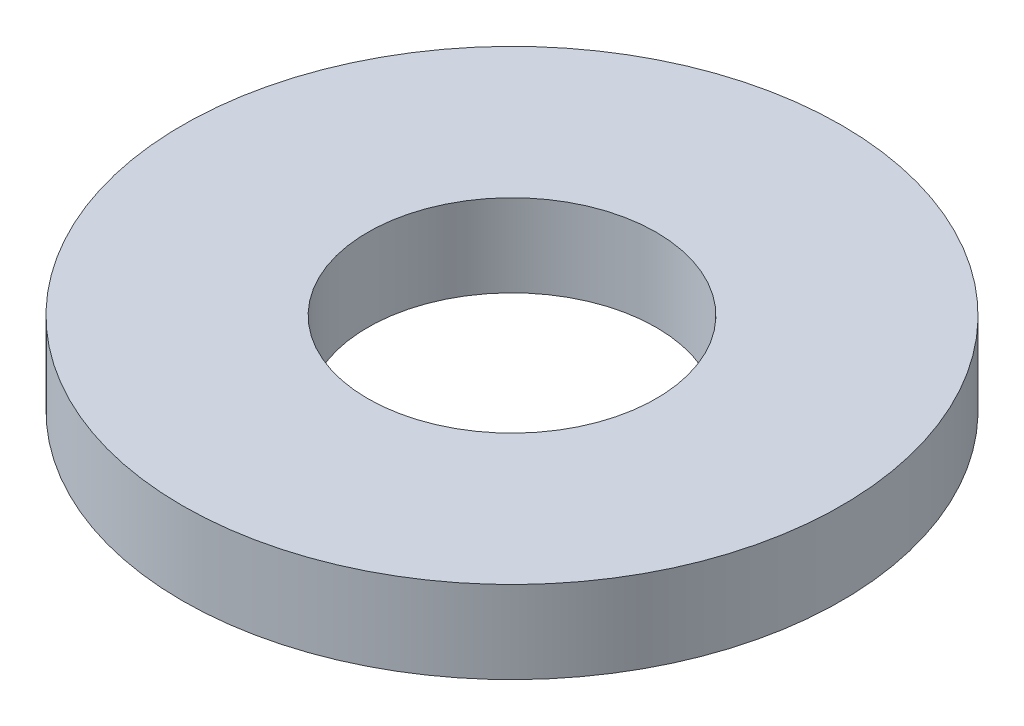
ISO-10303-21;
HEADER;
FILE_DESCRIPTION(('STEP AP214'),'2;1');
FILE_NAME('part.step','',(''),(''),'','','');
FILE_SCHEMA(('AUTOMOTIVE_DESIGN { 1 0 10303 214 1 1 1 1 }'));
ENDSEC;
DATA;
#1=APPLICATION_CONTEXT('core data for automotive mechanical design processes');
#2=APPLICATION_PROTOCOL_DEFINITION('international standard','automotive_design',2000,#1);
#3=PRODUCT_CONTEXT('',#1,'mechanical');
#4=PRODUCT('Part','Part','',(#3));
#5=PRODUCT_RELATED_PRODUCT_CATEGORY('part','',(#4));
#6=PRODUCT_DEFINITION_FORMATION('','',#4);
#7=PRODUCT_DEFINITION_CONTEXT('part definition',#1,'design');
#8=PRODUCT_DEFINITION('design','',#6,#7);
#9=PRODUCT_DEFINITION_SHAPE('','',#8);
#10=(LENGTH_UNIT() NAMED_UNIT(*) SI_UNIT(.MILLI.,.METRE.));
#11=(NAMED_UNIT(*) PLANE_ANGLE_UNIT() SI_UNIT($,.RADIAN.));
#12=(NAMED_UNIT(*) SI_UNIT($,.STERADIAN.) SOLID_ANGLE_UNIT());
#13=UNCERTAINTY_MEASURE_WITH_UNIT(LENGTH_MEASURE(1.E-05),#10,'distance_accuracy_value','');
#14=(GEOMETRIC_REPRESENTATION_CONTEXT(3) GLOBAL_UNCERTAINTY_ASSIGNED_CONTEXT((#13)) GLOBAL_UNIT_ASSIGNED_CONTEXT((#10,
#11,#12)) REPRESENTATION_CONTEXT('',''));
#15=CARTESIAN_POINT('',(0.,0.,0.));
#16=DIRECTION('',(0.,0.,1.));
#17=DIRECTION('',(1.,0.,0.));
#18=AXIS2_PLACEMENT_3D('',#15,#16,#17);
#19=CARTESIAN_POINT('',(0.,1.,0.));
#20=DIRECTION('',(0.,1.,0.));
#21=DIRECTION('',(0.,0.,1.));
#22=AXIS2_PLACEMENT_3D('',#19,#20,#21);
#23=PLANE('',#22);
#24=CARTESIAN_POINT('',(0.,1.,0.));
#25=DIRECTION('',(0.,1.,0.));
#26=DIRECTION('',(0.,0.,1.));
#27=AXIS2_PLACEMENT_3D('',#24,#25,#26);
#28=CIRCLE('',#27,4.);
#29=CARTESIAN_POINT('',(0.,1.,4.));
#30=VERTEX_POINT('',#29);
#31=EDGE_CURVE('E10',#30,#30,#28,.T.);
#32=ORIENTED_EDGE('',*,*,#31,.T.);
#33=EDGE_LOOP('',(#32));
#34=FACE_BOUND('',#33,.T.);
#35=CARTESIAN_POINT('',(0.,1.,0.));
#36=DIRECTION('',(0.,1.,0.));
#37=DIRECTION('',(0.,0.,1.));
#38=AXIS2_PLACEMENT_3D('',#35,#36,#37);
#39=CIRCLE('',#38,1.75);
#40=CARTESIAN_POINT('',(0.,1.,1.75));
#41=VERTEX_POINT('',#40);
#42=EDGE_CURVE('E50',#41,#41,#39,.T.);
#43=ORIENTED_EDGE('',*,*,#42,.F.);
#44=EDGE_LOOP('',(#43));
#45=FACE_BOUND('',#44,.T.);
#46=ADVANCED_FACE('F39',(#34,#45),#23,.T.);
#47=CARTESIAN_POINT('',(0.,0.,0.));
#48=DIRECTION('',(0.,1.,0.));
#49=DIRECTION('',(0.,0.,1.));
#50=AXIS2_PLACEMENT_3D('',#47,#48,#49);
#51=PLANE('',#50);
#52=CARTESIAN_POINT('',(0.,0.,0.));
#53=DIRECTION('',(0.,1.,0.));
#54=DIRECTION('',(0.,0.,1.));
#55=AXIS2_PLACEMENT_3D('',#52,#53,#54);
#56=CIRCLE('',#55,4.);
#57=CARTESIAN_POINT('',(0.,0.,4.));
#58=VERTEX_POINT('',#57);
#59=EDGE_CURVE('E43',#58,#58,#56,.T.);
#60=ORIENTED_EDGE('',*,*,#59,.F.);
#61=EDGE_LOOP('',(#60));
#62=FACE_BOUND('',#61,.T.);
#63=CARTESIAN_POINT('',(0.,0.,0.));
#64=DIRECTION('',(0.,1.,0.));
#65=DIRECTION('',(0.,0.,1.));
#66=AXIS2_PLACEMENT_3D('',#63,#64,#65);
#67=CIRCLE('',#66,1.75);
#68=CARTESIAN_POINT('',(0.,0.,1.75));
#69=VERTEX_POINT('',#68);
#70=EDGE_CURVE('E52',#69,#69,#67,.T.);
#71=ORIENTED_EDGE('',*,*,#70,.T.);
#72=EDGE_LOOP('',(#71));
#73=FACE_BOUND('',#72,.T.);
#74=ADVANCED_FACE('F62',(#62,#73),#51,.F.);
#75=CARTESIAN_POINT('',(0.,1.,0.));
#76=DIRECTION('',(0.,-1.,0.));
#77=DIRECTION('',(0.,0.,-1.));
#78=AXIS2_PLACEMENT_3D('',#75,#76,#77);
#79=CYLINDRICAL_SURFACE('',#78,4.);
#80=ORIENTED_EDGE('',*,*,#31,.F.);
#81=EDGE_LOOP('',(#80));
#82=FACE_BOUND('',#81,.T.);
#83=ORIENTED_EDGE('',*,*,#59,.T.);
#84=EDGE_LOOP('',(#83));
#85=FACE_BOUND('',#84,.T.);
#86=ADVANCED_FACE('F41',(#82,#85),#79,.T.);
#87=CARTESIAN_POINT('',(0.,1.,0.));
#88=DIRECTION('',(0.,-1.,0.));
#89=DIRECTION('',(0.,0.,-1.));
#90=AXIS2_PLACEMENT_3D('',#87,#88,#89);
#91=CYLINDRICAL_SURFACE('',#90,1.75);
#92=ORIENTED_EDGE('',*,*,#42,.T.);
#93=EDGE_LOOP('',(#92));
#94=FACE_BOUND('',#93,.T.);
#95=ORIENTED_EDGE('',*,*,#70,.F.);
#96=EDGE_LOOP('',(#95));
#97=FACE_BOUND('',#96,.T.);
#98=ADVANCED_FACE('F58',(#94,#97),#91,.F.);
#99=CLOSED_SHELL('',(#46,#74,#86,#98));
#100=MANIFOLD_SOLID_BREP('B2',#99);
#101=ADVANCED_BREP_SHAPE_REPRESENTATION('',(#18,#100),#14);
#102=SHAPE_DEFINITION_REPRESENTATION(#9,#101);
ENDSEC;
END-ISO-10303-21;
